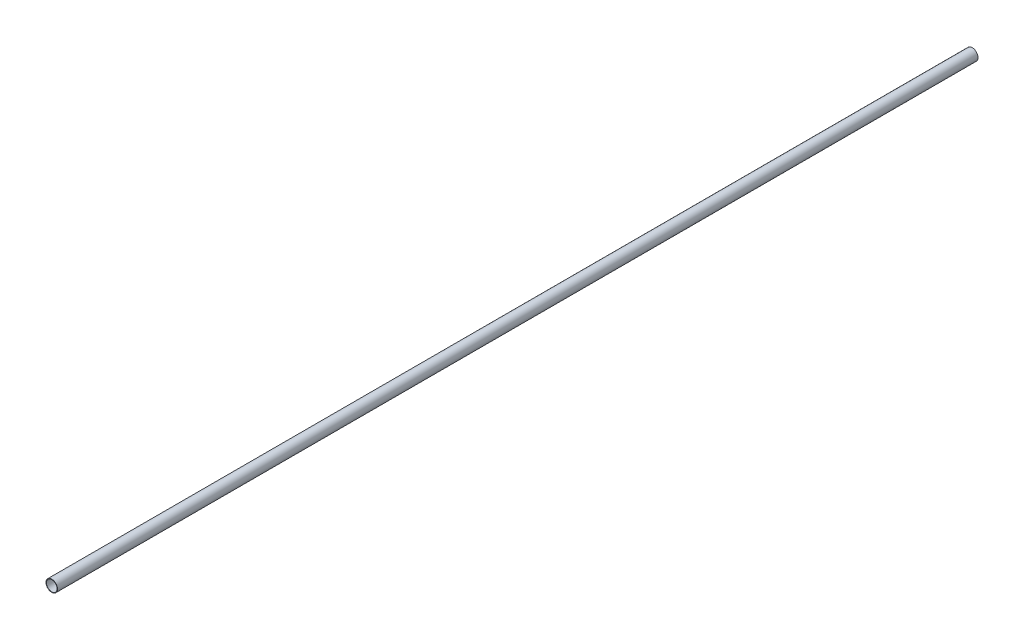
ISO-10303-21;
HEADER;
FILE_DESCRIPTION(('STEP AP214'),'2;1');
FILE_NAME('part.step','',(''),(''),'','','');
FILE_SCHEMA(('AUTOMOTIVE_DESIGN { 1 0 10303 214 1 1 1 1 }'));
ENDSEC;
DATA;
#1=APPLICATION_CONTEXT('core data for automotive mechanical design processes');
#2=APPLICATION_PROTOCOL_DEFINITION('international standard','automotive_design',2000,#1);
#3=PRODUCT_CONTEXT('',#1,'mechanical');
#4=PRODUCT('Part','Part','',(#3));
#5=PRODUCT_RELATED_PRODUCT_CATEGORY('part','',(#4));
#6=PRODUCT_DEFINITION_FORMATION('','',#4);
#7=PRODUCT_DEFINITION_CONTEXT('part definition',#1,'design');
#8=PRODUCT_DEFINITION('design','',#6,#7);
#9=PRODUCT_DEFINITION_SHAPE('','',#8);
#10=(LENGTH_UNIT() NAMED_UNIT(*) SI_UNIT(.MILLI.,.METRE.));
#11=(NAMED_UNIT(*) PLANE_ANGLE_UNIT() SI_UNIT($,.RADIAN.));
#12=(NAMED_UNIT(*) SI_UNIT($,.STERADIAN.) SOLID_ANGLE_UNIT());
#13=UNCERTAINTY_MEASURE_WITH_UNIT(LENGTH_MEASURE(1.E-05),#10,'distance_accuracy_value','');
#14=(GEOMETRIC_REPRESENTATION_CONTEXT(3) GLOBAL_UNCERTAINTY_ASSIGNED_CONTEXT((#13)) GLOBAL_UNIT_ASSIGNED_CONTEXT((#10,
#11,#12)) REPRESENTATION_CONTEXT('',''));
#15=CARTESIAN_POINT('',(0.,0.,0.));
#16=DIRECTION('',(0.,0.,1.));
#17=DIRECTION('',(1.,0.,0.));
#18=AXIS2_PLACEMENT_3D('',#15,#16,#17);
#19=CARTESIAN_POINT('',(0.,0.,-2000.));
#20=DIRECTION('',(0.,0.,1.));
#21=DIRECTION('',(1.,0.,0.));
#22=AXIS2_PLACEMENT_3D('',#19,#20,#21);
#23=CYLINDRICAL_SURFACE('',#22,12.5);
#24=CARTESIAN_POINT('',(0.,0.,-2000.));
#25=DIRECTION('',(0.,0.,1.));
#26=DIRECTION('',(1.,0.,0.));
#27=AXIS2_PLACEMENT_3D('',#24,#25,#26);
#28=CIRCLE('',#27,12.5);
#29=CARTESIAN_POINT('',(12.5,0.,-2000.));
#30=VERTEX_POINT('',#29);
#31=EDGE_CURVE('E10',#30,#30,#28,.T.);
#32=ORIENTED_EDGE('',*,*,#31,.T.);
#33=EDGE_LOOP('',(#32));
#34=FACE_BOUND('',#33,.T.);
#35=CARTESIAN_POINT('',(0.,0.,0.));
#36=DIRECTION('',(0.,0.,1.));
#37=DIRECTION('',(1.,0.,0.));
#38=AXIS2_PLACEMENT_3D('',#35,#36,#37);
#39=CIRCLE('',#38,12.5);
#40=CARTESIAN_POINT('',(12.5,0.,0.));
#41=VERTEX_POINT('',#40);
#42=EDGE_CURVE('E45',#41,#41,#39,.T.);
#43=ORIENTED_EDGE('',*,*,#42,.F.);
#44=EDGE_LOOP('',(#43));
#45=FACE_BOUND('',#44,.T.);
#46=ADVANCED_FACE('F39',(#34,#45),#23,.T.);
#47=CARTESIAN_POINT('',(0.,0.,-2000.));
#48=DIRECTION('',(0.,0.,1.));
#49=DIRECTION('',(1.,0.,0.));
#50=AXIS2_PLACEMENT_3D('',#47,#48,#49);
#51=PLANE('',#50);
#52=CARTESIAN_POINT('',(0.,0.,-2000.));
#53=DIRECTION('',(0.,0.,1.));
#54=DIRECTION('',(1.,0.,0.));
#55=AXIS2_PLACEMENT_3D('',#52,#53,#54);
#56=CIRCLE('',#55,11.5);
#57=CARTESIAN_POINT('',(11.5,0.,-2000.));
#58=VERTEX_POINT('',#57);
#59=EDGE_CURVE('E47',#58,#58,#56,.T.);
#60=ORIENTED_EDGE('',*,*,#59,.T.);
#61=EDGE_LOOP('',(#60));
#62=FACE_BOUND('',#61,.T.);
#63=ORIENTED_EDGE('',*,*,#31,.F.);
#64=EDGE_LOOP('',(#63));
#65=FACE_BOUND('',#64,.T.);
#66=ADVANCED_FACE('F60',(#62,#65),#51,.F.);
#67=CARTESIAN_POINT('',(0.,0.,0.));
#68=DIRECTION('',(0.,0.,1.));
#69=DIRECTION('',(1.,0.,0.));
#70=AXIS2_PLACEMENT_3D('',#67,#68,#69);
#71=PLANE('',#70);
#72=CARTESIAN_POINT('',(0.,0.,0.));
#73=DIRECTION('',(0.,0.,1.));
#74=DIRECTION('',(1.,0.,0.));
#75=AXIS2_PLACEMENT_3D('',#72,#73,#74);
#76=CIRCLE('',#75,11.5);
#77=CARTESIAN_POINT('',(11.5,0.,0.));
#78=VERTEX_POINT('',#77);
#79=EDGE_CURVE('E51',#78,#78,#76,.T.);
#80=ORIENTED_EDGE('',*,*,#79,.F.);
#81=EDGE_LOOP('',(#80));
#82=FACE_BOUND('',#81,.T.);
#83=ORIENTED_EDGE('',*,*,#42,.T.);
#84=EDGE_LOOP('',(#83));
#85=FACE_BOUND('',#84,.T.);
#86=ADVANCED_FACE('F64',(#82,#85),#71,.T.);
#87=CARTESIAN_POINT('',(0.,0.,-2000.));
#88=DIRECTION('',(0.,0.,1.));
#89=DIRECTION('',(1.,0.,0.));
#90=AXIS2_PLACEMENT_3D('',#87,#88,#89);
#91=CYLINDRICAL_SURFACE('',#90,11.5);
#92=ORIENTED_EDGE('',*,*,#59,.F.);
#93=EDGE_LOOP('',(#92));
#94=FACE_BOUND('',#93,.T.);
#95=ORIENTED_EDGE('',*,*,#79,.T.);
#96=EDGE_LOOP('',(#95));
#97=FACE_BOUND('',#96,.T.);
#98=ADVANCED_FACE('F58',(#94,#97),#91,.F.);
#99=CLOSED_SHELL('',(#46,#66,#86,#98));
#100=MANIFOLD_SOLID_BREP('B2',#99);
#101=ADVANCED_BREP_SHAPE_REPRESENTATION('',(#18,#100),#14);
#102=SHAPE_DEFINITION_REPRESENTATION(#9,#101);
ENDSEC;
END-ISO-10303-21;
